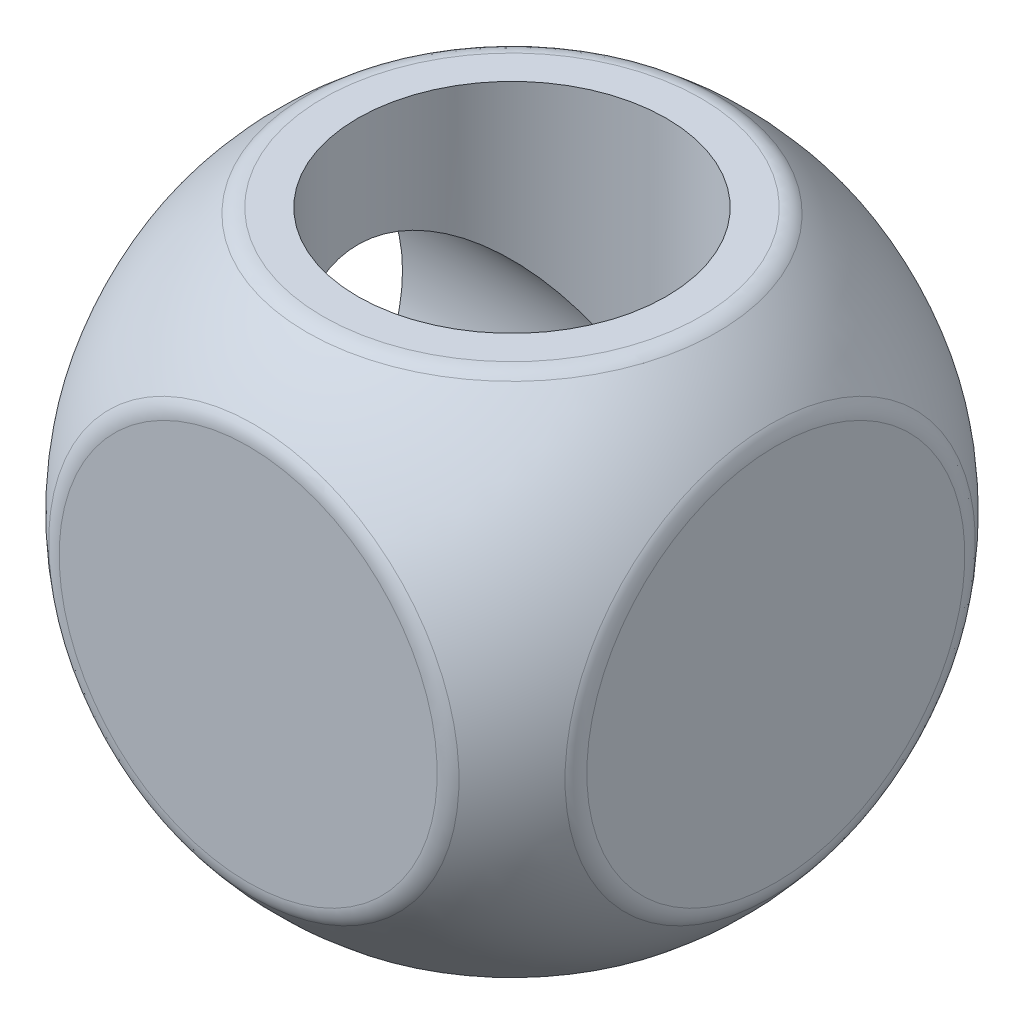
ISO-10303-21;
HEADER;
FILE_DESCRIPTION(('STEP AP214'),'2;1');
FILE_NAME('part.step','',(''),(''),'','','');
FILE_SCHEMA(('AUTOMOTIVE_DESIGN { 1 0 10303 214 1 1 1 1 }'));
ENDSEC;
DATA;
#1=APPLICATION_CONTEXT('core data for automotive mechanical design processes');
#2=APPLICATION_PROTOCOL_DEFINITION('international standard','automotive_design',2000,#1);
#3=PRODUCT_CONTEXT('',#1,'mechanical');
#4=PRODUCT('Part','Part','',(#3));
#5=PRODUCT_RELATED_PRODUCT_CATEGORY('part','',(#4));
#6=PRODUCT_DEFINITION_FORMATION('','',#4);
#7=PRODUCT_DEFINITION_CONTEXT('part definition',#1,'design');
#8=PRODUCT_DEFINITION('design','',#6,#7);
#9=PRODUCT_DEFINITION_SHAPE('','',#8);
#10=(LENGTH_UNIT() NAMED_UNIT(*) SI_UNIT(.MILLI.,.METRE.));
#11=(NAMED_UNIT(*) PLANE_ANGLE_UNIT() SI_UNIT($,.RADIAN.));
#12=(NAMED_UNIT(*) SI_UNIT($,.STERADIAN.) SOLID_ANGLE_UNIT());
#13=UNCERTAINTY_MEASURE_WITH_UNIT(LENGTH_MEASURE(1.E-05),#10,'distance_accuracy_value','');
#14=(GEOMETRIC_REPRESENTATION_CONTEXT(3) GLOBAL_UNCERTAINTY_ASSIGNED_CONTEXT((#13)) GLOBAL_UNIT_ASSIGNED_CONTEXT((#10,
#11,#12)) REPRESENTATION_CONTEXT('',''));
#15=CARTESIAN_POINT('',(0.,0.,0.));
#16=DIRECTION('',(0.,0.,1.));
#17=DIRECTION('',(1.,0.,0.));
#18=AXIS2_PLACEMENT_3D('',#15,#16,#17);
#19=CARTESIAN_POINT('',(0.,0.,0.));
#20=DIRECTION('',(0.,-1.,0.));
#21=DIRECTION('',(-1.,0.,0.));
#22=AXIS2_PLACEMENT_3D('',#19,#20,#21);
#23=SPHERICAL_SURFACE('',#22,12.7);
#24=CARTESIAN_POINT('',(-9.94290598290599,0.,0.));
#25=DIRECTION('',(1.,0.,0.));
#26=DIRECTION('',(0.,1.,0.));
#27=AXIS2_PLACEMENT_3D('',#24,#25,#26);
#28=CIRCLE('',#27,7.90117843205002);
#29=CARTESIAN_POINT('',(-9.94290598290601,7.90117843204998,0.));
#30=VERTEX_POINT('',#29);
#31=EDGE_CURVE('E138',#30,#30,#28,.T.);
#32=ORIENTED_EDGE('',*,*,#31,.T.);
#33=EDGE_LOOP('',(#32));
#34=FACE_BOUND('',#33,.T.);
#35=CARTESIAN_POINT('',(0.,-9.94290598290599,0.));
#36=DIRECTION('',(0.,1.,0.));
#37=DIRECTION('',(0.,0.,1.));
#38=AXIS2_PLACEMENT_3D('',#35,#36,#37);
#39=CIRCLE('',#38,7.90117843205002);
#40=CARTESIAN_POINT('',(0.,-9.94290598290599,7.90117843205002));
#41=VERTEX_POINT('',#40);
#42=EDGE_CURVE('E135',#41,#41,#39,.T.);
#43=ORIENTED_EDGE('',*,*,#42,.T.);
#44=EDGE_LOOP('',(#43));
#45=FACE_BOUND('',#44,.T.);
#46=CARTESIAN_POINT('',(9.94290598290599,1.04146412079564E-13,0.));
#47=DIRECTION('',(-1.,0.,0.));
#48=DIRECTION('',(0.,-1.,0.));
#49=AXIS2_PLACEMENT_3D('',#46,#47,#48);
#50=CIRCLE('',#49,7.90117843205002);
#51=CARTESIAN_POINT('',(9.94290598290607,-7.90117843204991,0.));
#52=VERTEX_POINT('',#51);
#53=EDGE_CURVE('E132',#52,#52,#50,.T.);
#54=ORIENTED_EDGE('',*,*,#53,.T.);
#55=EDGE_LOOP('',(#54));
#56=FACE_BOUND('',#55,.T.);
#57=CARTESIAN_POINT('',(0.,0.,-9.94290598290599));
#58=DIRECTION('',(0.,0.,1.));
#59=DIRECTION('',(0.,-1.,0.));
#60=AXIS2_PLACEMENT_3D('',#57,#58,#59);
#61=CIRCLE('',#60,7.90117843205002);
#62=CARTESIAN_POINT('',(0.,-7.90117843205005,-9.94290598290596));
#63=VERTEX_POINT('',#62);
#64=EDGE_CURVE('E129',#63,#63,#61,.T.);
#65=ORIENTED_EDGE('',*,*,#64,.T.);
#66=EDGE_LOOP('',(#65));
#67=FACE_BOUND('',#66,.T.);
#68=CARTESIAN_POINT('',(0.,1.04146412079564E-13,9.94290598290599));
#69=DIRECTION('',(0.,0.,-1.));
#70=DIRECTION('',(0.,1.,0.));
#71=AXIS2_PLACEMENT_3D('',#68,#69,#70);
#72=CIRCLE('',#71,7.90117843205002);
#73=CARTESIAN_POINT('',(0.,7.90117843205012,9.9429059829059));
#74=VERTEX_POINT('',#73);
#75=EDGE_CURVE('E126',#74,#74,#72,.T.);
#76=ORIENTED_EDGE('',*,*,#75,.T.);
#77=EDGE_LOOP('',(#76));
#78=FACE_BOUND('',#77,.T.);
#79=CARTESIAN_POINT('',(0.,9.94290598290599,0.));
#80=DIRECTION('',(0.,-1.,0.));
#81=DIRECTION('',(0.,0.,-1.));
#82=AXIS2_PLACEMENT_3D('',#79,#80,#81);
#83=CIRCLE('',#82,7.90117843205002);
#84=CARTESIAN_POINT('',(0.,9.94290598290599,-7.90117843205002));
#85=VERTEX_POINT('',#84);
#86=EDGE_CURVE('E123',#85,#85,#83,.T.);
#87=ORIENTED_EDGE('',*,*,#86,.T.);
#88=EDGE_LOOP('',(#87));
#89=FACE_BOUND('',#88,.T.);
#90=ADVANCED_FACE('F53',(#34,#45,#56,#67,#78,#89),#23,.T.);
#91=CARTESIAN_POINT('',(0.,10.16,0.));
#92=DIRECTION('',(0.,1.,0.));
#93=DIRECTION('',(0.,0.,1.));
#94=AXIS2_PLACEMENT_3D('',#91,#92,#93);
#95=PLANE('',#94);
#96=CARTESIAN_POINT('',(0.,10.16,0.));
#97=DIRECTION('',(0.,1.,0.));
#98=DIRECTION('',(0.,0.,1.));
#99=AXIS2_PLACEMENT_3D('',#96,#97,#98);
#100=CIRCLE('',#99,5.94359999999999);
#101=CARTESIAN_POINT('',(0.,10.16,5.94359999999999));
#102=VERTEX_POINT('',#101);
#103=EDGE_CURVE('E120',#102,#102,#100,.T.);
#104=ORIENTED_EDGE('',*,*,#103,.F.);
#105=EDGE_LOOP('',(#104));
#106=FACE_BOUND('',#105,.T.);
#107=CARTESIAN_POINT('',(0.,10.16,0.));
#108=DIRECTION('',(0.,1.,0.));
#109=DIRECTION('',(0.,0.,1.));
#110=AXIS2_PLACEMENT_3D('',#107,#108,#109);
#111=CIRCLE('',#110,7.27903839803033);
#112=CARTESIAN_POINT('',(0.,10.16,7.27903839803033));
#113=VERTEX_POINT('',#112);
#114=EDGE_CURVE('E156',#113,#113,#111,.T.);
#115=ORIENTED_EDGE('',*,*,#114,.T.);
#116=EDGE_LOOP('',(#115));
#117=FACE_BOUND('',#116,.T.);
#118=ADVANCED_FACE('F193',(#106,#117),#95,.T.);
#119=CARTESIAN_POINT('',(-10.16,0.,0.));
#120=DIRECTION('',(-1.,0.,0.));
#121=DIRECTION('',(0.,0.,1.));
#122=AXIS2_PLACEMENT_3D('',#119,#120,#121);
#123=PLANE('',#122);
#124=CARTESIAN_POINT('',(-10.16,0.,0.));
#125=DIRECTION('',(-1.,0.,0.));
#126=DIRECTION('',(0.,0.,1.));
#127=AXIS2_PLACEMENT_3D('',#124,#125,#126);
#128=CIRCLE('',#127,5.94359999999999);
#129=CARTESIAN_POINT('',(-10.16,0.,5.94359999999999));
#130=VERTEX_POINT('',#129);
#131=EDGE_CURVE('E105',#130,#130,#128,.T.);
#132=ORIENTED_EDGE('',*,*,#131,.F.);
#133=EDGE_LOOP('',(#132));
#134=FACE_BOUND('',#133,.T.);
#135=CARTESIAN_POINT('',(-10.16,0.,0.));
#136=DIRECTION('',(-1.,0.,0.));
#137=DIRECTION('',(0.,-1.,0.));
#138=AXIS2_PLACEMENT_3D('',#135,#136,#137);
#139=CIRCLE('',#138,7.27903839803033);
#140=CARTESIAN_POINT('',(-10.16,-7.27903839803037,0.));
#141=VERTEX_POINT('',#140);
#142=EDGE_CURVE('E141',#141,#141,#139,.T.);
#143=ORIENTED_EDGE('',*,*,#142,.T.);
#144=EDGE_LOOP('',(#143));
#145=FACE_BOUND('',#144,.T.);
#146=ADVANCED_FACE('F199',(#134,#145),#123,.T.);
#147=CARTESIAN_POINT('',(0.,-10.16,0.));
#148=DIRECTION('',(0.,-1.,0.));
#149=DIRECTION('',(0.,0.,1.));
#150=AXIS2_PLACEMENT_3D('',#147,#148,#149);
#151=PLANE('',#150);
#152=CARTESIAN_POINT('',(0.,-10.16,0.));
#153=DIRECTION('',(0.,-1.,0.));
#154=DIRECTION('',(0.,0.,-1.));
#155=AXIS2_PLACEMENT_3D('',#152,#153,#154);
#156=CIRCLE('',#155,5.94359999999999);
#157=CARTESIAN_POINT('',(0.,-10.16,-5.94359999999999));
#158=VERTEX_POINT('',#157);
#159=EDGE_CURVE('E257',#158,#158,#156,.T.);
#160=ORIENTED_EDGE('',*,*,#159,.F.);
#161=EDGE_LOOP('',(#160));
#162=FACE_BOUND('',#161,.T.);
#163=CARTESIAN_POINT('',(0.,-10.16,0.));
#164=DIRECTION('',(0.,-1.,0.));
#165=DIRECTION('',(0.,0.,-1.));
#166=AXIS2_PLACEMENT_3D('',#163,#164,#165);
#167=CIRCLE('',#166,7.27903839803033);
#168=CARTESIAN_POINT('',(0.,-10.16,-7.27903839803033));
#169=VERTEX_POINT('',#168);
#170=EDGE_CURVE('E144',#169,#169,#167,.T.);
#171=ORIENTED_EDGE('',*,*,#170,.T.);
#172=EDGE_LOOP('',(#171));
#173=FACE_BOUND('',#172,.T.);
#174=ADVANCED_FACE('F244',(#162,#173),#151,.T.);
#175=CARTESIAN_POINT('',(10.16,1.06420351207939E-13,0.));
#176=DIRECTION('',(1.,0.,0.));
#177=DIRECTION('',(0.,0.,1.));
#178=AXIS2_PLACEMENT_3D('',#175,#176,#177);
#179=PLANE('',#178);
#180=CARTESIAN_POINT('',(10.16,1.06420351207939E-13,0.));
#181=DIRECTION('',(1.,0.,0.));
#182=DIRECTION('',(0.,1.,0.));
#183=AXIS2_PLACEMENT_3D('',#180,#181,#182);
#184=CIRCLE('',#183,7.27903839803033);
#185=CARTESIAN_POINT('',(10.1599999999999,7.27903839803044,0.));
#186=VERTEX_POINT('',#185);
#187=EDGE_CURVE('E147',#186,#186,#184,.T.);
#188=ORIENTED_EDGE('',*,*,#187,.T.);
#189=EDGE_LOOP('',(#188));
#190=FACE_BOUND('',#189,.T.);
#191=ADVANCED_FACE('F238',(#190),#179,.T.);
#192=CARTESIAN_POINT('',(0.,0.,-10.16));
#193=DIRECTION('',(0.,0.,-1.));
#194=DIRECTION('',(0.,1.,0.));
#195=AXIS2_PLACEMENT_3D('',#192,#193,#194);
#196=PLANE('',#195);
#197=CARTESIAN_POINT('',(0.,0.,-10.16));
#198=DIRECTION('',(0.,0.,-1.));
#199=DIRECTION('',(0.,1.,0.));
#200=AXIS2_PLACEMENT_3D('',#197,#198,#199);
#201=CIRCLE('',#200,7.27903839803033);
#202=CARTESIAN_POINT('',(0.,7.27903839803029,-10.16));
#203=VERTEX_POINT('',#202);
#204=EDGE_CURVE('E150',#203,#203,#201,.T.);
#205=ORIENTED_EDGE('',*,*,#204,.T.);
#206=EDGE_LOOP('',(#205));
#207=FACE_BOUND('',#206,.T.);
#208=ADVANCED_FACE('F234',(#207),#196,.T.);
#209=CARTESIAN_POINT('',(0.,1.06420351207939E-13,10.16));
#210=DIRECTION('',(0.,0.,1.));
#211=DIRECTION('',(0.,-1.,0.));
#212=AXIS2_PLACEMENT_3D('',#209,#210,#211);
#213=PLANE('',#212);
#214=CARTESIAN_POINT('',(0.,1.06420351207939E-13,10.16));
#215=DIRECTION('',(0.,0.,1.));
#216=DIRECTION('',(0.,-1.,0.));
#217=AXIS2_PLACEMENT_3D('',#214,#215,#216);
#218=CIRCLE('',#217,7.27903839803033);
#219=CARTESIAN_POINT('',(0.,-7.27903839803022,10.1600000000001));
#220=VERTEX_POINT('',#219);
#221=EDGE_CURVE('E153',#220,#220,#218,.T.);
#222=ORIENTED_EDGE('',*,*,#221,.T.);
#223=EDGE_LOOP('',(#222));
#224=FACE_BOUND('',#223,.T.);
#225=ADVANCED_FACE('F209',(#224),#213,.T.);
#226=CARTESIAN_POINT('',(-9.16,0.,0.));
#227=DIRECTION('',(-1.,0.,0.));
#228=DIRECTION('',(0.,-1.,0.));
#229=AXIS2_PLACEMENT_3D('',#226,#227,#228);
#230=TOROIDAL_SURFACE('',#229,7.27903839803033,1.);
#231=ORIENTED_EDGE('',*,*,#142,.F.);
#232=EDGE_LOOP('',(#231));
#233=FACE_BOUND('',#232,.T.);
#234=ORIENTED_EDGE('',*,*,#31,.F.);
#235=EDGE_LOOP('',(#234));
#236=FACE_BOUND('',#235,.T.);
#237=ADVANCED_FACE('F205',(#233,#236),#230,.T.);
#238=CARTESIAN_POINT('',(0.,-9.16,0.));
#239=DIRECTION('',(0.,-1.,0.));
#240=DIRECTION('',(0.,0.,-1.));
#241=AXIS2_PLACEMENT_3D('',#238,#239,#240);
#242=TOROIDAL_SURFACE('',#241,7.27903839803033,1.);
#243=ORIENTED_EDGE('',*,*,#170,.F.);
#244=EDGE_LOOP('',(#243));
#245=FACE_BOUND('',#244,.T.);
#246=ORIENTED_EDGE('',*,*,#42,.F.);
#247=EDGE_LOOP('',(#246));
#248=FACE_BOUND('',#247,.T.);
#249=ADVANCED_FACE('F208',(#245,#248),#242,.T.);
#250=CARTESIAN_POINT('',(9.16,0.,0.));
#251=DIRECTION('',(1.,0.,0.));
#252=DIRECTION('',(0.,1.,0.));
#253=AXIS2_PLACEMENT_3D('',#250,#251,#252);
#254=TOROIDAL_SURFACE('',#253,7.27903839803033,1.);
#255=ORIENTED_EDGE('',*,*,#187,.F.);
#256=EDGE_LOOP('',(#255));
#257=FACE_BOUND('',#256,.T.);
#258=ORIENTED_EDGE('',*,*,#53,.F.);
#259=EDGE_LOOP('',(#258));
#260=FACE_BOUND('',#259,.T.);
#261=ADVANCED_FACE('F213',(#257,#260),#254,.T.);
#262=CARTESIAN_POINT('',(0.,0.,-9.16));
#263=DIRECTION('',(0.,0.,-1.));
#264=DIRECTION('',(0.,1.,0.));
#265=AXIS2_PLACEMENT_3D('',#262,#263,#264);
#266=TOROIDAL_SURFACE('',#265,7.27903839803033,1.);
#267=ORIENTED_EDGE('',*,*,#204,.F.);
#268=EDGE_LOOP('',(#267));
#269=FACE_BOUND('',#268,.T.);
#270=ORIENTED_EDGE('',*,*,#64,.F.);
#271=EDGE_LOOP('',(#270));
#272=FACE_BOUND('',#271,.T.);
#273=ADVANCED_FACE('F217',(#269,#272),#266,.T.);
#274=CARTESIAN_POINT('',(0.,0.,9.16));
#275=DIRECTION('',(0.,0.,1.));
#276=DIRECTION('',(0.,-1.,0.));
#277=AXIS2_PLACEMENT_3D('',#274,#275,#276);
#278=TOROIDAL_SURFACE('',#277,7.27903839803033,1.);
#279=ORIENTED_EDGE('',*,*,#221,.F.);
#280=EDGE_LOOP('',(#279));
#281=FACE_BOUND('',#280,.T.);
#282=ORIENTED_EDGE('',*,*,#75,.F.);
#283=EDGE_LOOP('',(#282));
#284=FACE_BOUND('',#283,.T.);
#285=ADVANCED_FACE('F185',(#281,#284),#278,.T.);
#286=CARTESIAN_POINT('',(0.,9.16,0.));
#287=DIRECTION('',(0.,1.,0.));
#288=DIRECTION('',(0.,0.,1.));
#289=AXIS2_PLACEMENT_3D('',#286,#287,#288);
#290=TOROIDAL_SURFACE('',#289,7.27903839803033,1.);
#291=ORIENTED_EDGE('',*,*,#114,.F.);
#292=EDGE_LOOP('',(#291));
#293=FACE_BOUND('',#292,.T.);
#294=ORIENTED_EDGE('',*,*,#86,.F.);
#295=EDGE_LOOP('',(#294));
#296=FACE_BOUND('',#295,.T.);
#297=ADVANCED_FACE('F55',(#293,#296),#290,.T.);
#298=CARTESIAN_POINT('',(-10.16,0.,0.));
#299=DIRECTION('',(-1.,0.,0.));
#300=DIRECTION('',(0.,0.,1.));
#301=AXIS2_PLACEMENT_3D('',#298,#299,#300);
#302=CYLINDRICAL_SURFACE('',#301,5.94359999999999);
#303=ORIENTED_EDGE('',*,*,#131,.T.);
#304=EDGE_LOOP('',(#303));
#305=FACE_BOUND('',#304,.T.);
#306=CARTESIAN_POINT('',(0.,0.,0.));
#307=DIRECTION('',(-0.707106781186547,0.707106781186547,0.));
#308=DIRECTION('',(0.707106781186547,0.707106781186547,0.));
#309=AXIS2_PLACEMENT_3D('',#306,#307,#308);
#310=ELLIPSE('',#309,8.40551972932072,5.94359999999999);
#311=CARTESIAN_POINT('',(0.,0.,-5.94359999999999));
#312=VERTEX_POINT('',#311);
#313=CARTESIAN_POINT('',(0.,0.,5.94359999999999));
#314=VERTEX_POINT('',#313);
#315=EDGE_CURVE('E110',#312,#314,#310,.T.);
#316=ORIENTED_EDGE('',*,*,#315,.F.);
#317=CARTESIAN_POINT('',(0.,0.,0.));
#318=DIRECTION('',(0.707106781186547,0.707106781186547,0.));
#319=DIRECTION('',(-0.707106781186547,0.707106781186547,0.));
#320=AXIS2_PLACEMENT_3D('',#317,#318,#319);
#321=ELLIPSE('',#320,8.40551972932072,5.94359999999999);
#322=EDGE_CURVE('E79',#314,#312,#321,.F.);
#323=ORIENTED_EDGE('',*,*,#322,.F.);
#324=EDGE_LOOP('',(#316,#323));
#325=FACE_BOUND('',#324,.T.);
#326=ADVANCED_FACE('F174',(#305,#325),#302,.F.);
#327=CARTESIAN_POINT('',(2.54,0.,0.));
#328=DIRECTION('',(-1.,0.,0.));
#329=DIRECTION('',(0.,0.,1.));
#330=AXIS2_PLACEMENT_3D('',#327,#328,#329);
#331=CONICAL_SURFACE('',#330,5.9436,1.02974425867665);
#332=CARTESIAN_POINT('',(6.11127517525221,0.,0.));
#333=VERTEX_POINT('',#332);
#334=VERTEX_LOOP('',#333);
#335=FACE_BOUND('',#334,.T.);
#336=CARTESIAN_POINT('',(5.93961694446302,0.185163992280996,-0.217558068220168));
#337=CARTESIAN_POINT('',(5.94001982076634,0.197052694965491,-0.206558087179712));
#338=CARTESIAN_POINT('',(5.94042972087786,0.208006664197392,-0.194528299817152));
#339=CARTESIAN_POINT('',(5.94121662234365,0.227760290986906,-0.168795269030674));
#340=CARTESIAN_POINT('',(5.94159357029958,0.236556492100058,-0.155089392687374));
#341=CARTESIAN_POINT('',(5.94227335239499,0.25179396255021,-0.126390275049926));
#342=CARTESIAN_POINT('',(5.94257604238943,0.258230663546639,-0.111394605074271));
#343=CARTESIAN_POINT('',(5.94307397985393,0.268583304015923,-0.0805621316673078));
#344=CARTESIAN_POINT('',(5.94326925355374,0.272499858916901,-0.0647255346165941));
#345=CARTESIAN_POINT('',(5.9435363368348,0.277818881100302,-0.0321091072268573));
#346=CARTESIAN_POINT('',(5.94360396605528,0.279136286163141,-0.0153153261210944));
#347=CARTESIAN_POINT('',(5.94359566900095,0.278973256039045,0.0182608920201604));
#348=CARTESIAN_POINT('',(5.94351971687138,0.277492316953232,0.0350433264680787));
#349=CARTESIAN_POINT('',(5.9432308450632,0.271729708147783,0.0683247360281717));
#350=CARTESIAN_POINT('',(5.94301632204684,0.26741524314921,0.0848180411100224));
#351=CARTESIAN_POINT('',(5.94247317113181,0.256050769279073,0.116833508734265));
#352=CARTESIAN_POINT('',(5.94214454525705,0.249000808928228,0.132355688496276));
#353=CARTESIAN_POINT('',(5.94141565100352,0.232426048939563,0.161788702626177));
#354=CARTESIAN_POINT('',(5.94101622531063,0.222929820755899,0.17571562203392));
#355=CARTESIAN_POINT('',(5.9401905505409,0.201661885703491,0.201709058560483));
#356=CARTESIAN_POINT('',(5.93976430592551,0.189890556634943,0.213775883966801));
#357=CARTESIAN_POINT('',(5.9389508747827,0.164802005511641,0.235278226625749));
#358=CARTESIAN_POINT('',(5.93856287272295,0.151546728384088,0.244785930197398));
#359=CARTESIAN_POINT('',(5.93785800705852,0.123571049682073,0.261327620901443));
#360=CARTESIAN_POINT('',(5.93754112417781,0.108851046669468,0.268362278617546));
#361=CARTESIAN_POINT('',(5.93702928288412,0.0790246834817161,0.279452952907612));
#362=CARTESIAN_POINT('',(5.93682979408326,0.063959982919025,0.283620875238092));
#363=CARTESIAN_POINT('',(5.93655665364665,0.0333357046968885,0.289282348377472));
#364=CARTESIAN_POINT('',(5.93648297532201,0.0177762327096691,0.290776466398817));
#365=CARTESIAN_POINT('',(5.93647053301496,-0.012890646195057,0.291030060320541));
#366=CARTESIAN_POINT('',(5.93652774260504,-0.0279974424514174,0.289871149127713));
#367=CARTESIAN_POINT('',(5.93676217793374,-0.0577987355462884,0.285029106093408));
#368=CARTESIAN_POINT('',(5.93693939842511,-0.072493250381755,0.281346084613696));
#369=CARTESIAN_POINT('',(5.93739331675033,-0.101029977191345,0.271597321498294));
#370=CARTESIAN_POINT('',(5.93766979911105,-0.114873959812096,0.265536738343296));
#371=CARTESIAN_POINT('',(5.93829205513376,-0.141382899073077,0.251235819703023));
#372=CARTESIAN_POINT('',(5.93863783598509,-0.154047733183599,0.242995258029084));
#373=CARTESIAN_POINT('',(5.93937177105762,-0.178202051578166,0.22435007350474));
#374=CARTESIAN_POINT('',(5.9397607969926,-0.189652132181586,0.213894488195512));
#375=CARTESIAN_POINT('',(5.94053218981422,-0.210716870372379,0.191275090703256));
#376=CARTESIAN_POINT('',(5.94091455547042,-0.220331192017401,0.179110966564592));
#377=CARTESIAN_POINT('',(5.94164797073343,-0.237858137142535,0.152900913775669));
#378=CARTESIAN_POINT('',(5.94199716023002,-0.245687482107278,0.138799238994327));
#379=CARTESIAN_POINT('',(5.94260903352824,-0.258962903999543,0.10951398920265));
#380=CARTESIAN_POINT('',(5.94287170127182,-0.264408538582556,0.094330213994596));
#381=CARTESIAN_POINT('',(5.9432906497386,-0.272952177001047,0.0627324800965068));
#382=CARTESIAN_POINT('',(5.94344281204583,-0.275959744200517,0.0462939724001851));
#383=CARTESIAN_POINT('',(5.94360858300715,-0.279231588849202,0.0131448313348029));
#384=CARTESIAN_POINT('',(5.94362217371504,-0.279495510973378,-0.00356583700066791));
#385=CARTESIAN_POINT('',(5.9435082282806,-0.277253016251407,-0.0371126268401775));
#386=CARTESIAN_POINT('',(5.9433780719845,-0.274695166420026,-0.0539453337830179));
#387=CARTESIAN_POINT('',(5.94298701993831,-0.266782882786475,-0.0869402280763325));
#388=CARTESIAN_POINT('',(5.94272612037223,-0.261428367358155,-0.103102395840948));
#389=CARTESIAN_POINT('',(5.94210467398186,-0.248071692178901,-0.134217708040777));
#390=CARTESIAN_POINT('',(5.94174452340252,-0.240080036283156,-0.149175360715256));
#391=CARTESIAN_POINT('',(5.94096623572604,-0.221635241584248,-0.177487852597066));
#392=CARTESIAN_POINT('',(5.94054810513847,-0.211182379015785,-0.190842871423013));
#393=CARTESIAN_POINT('',(5.93971576780874,-0.188391003709184,-0.215179583619157));
#394=CARTESIAN_POINT('',(5.93930174758084,-0.176109380344237,-0.226214503614138));
#395=CARTESIAN_POINT('',(5.93851684036205,-0.149799625604449,-0.24596070970293));
#396=CARTESIAN_POINT('',(5.93814594254117,-0.135771934586961,-0.254672579934093));
#397=CARTESIAN_POINT('',(5.93750719545803,-0.106979857461018,-0.269146524043094));
#398=CARTESIAN_POINT('',(5.93723577074392,-0.0922685824331974,-0.275014093243929));
#399=CARTESIAN_POINT('',(5.936808341297,-0.0620473316089173,-0.284092574746136));
#400=CARTESIAN_POINT('',(5.93665230318696,-0.046537588170546,-0.287304255333369));
#401=CARTESIAN_POINT('',(5.93647808301429,-0.0157654218814558,-0.290881422403996));
#402=CARTESIAN_POINT('',(5.93645509904845,-0.000514481523743693,-0.291346062681055));
#403=CARTESIAN_POINT('',(5.93653677614085,0.0298473011214948,-0.289676976381787));
#404=CARTESIAN_POINT('',(5.93664145644178,0.0449581219430064,-0.287542858097479));
#405=CARTESIAN_POINT('',(5.93696443408802,0.074428878729596,-0.280794191411139));
#406=CARTESIAN_POINT('',(5.93718142347606,0.0887954078917324,-0.276208178048755));
#407=CARTESIAN_POINT('',(5.9377040087587,0.116561742826154,-0.264735269779951));
#408=CARTESIAN_POINT('',(5.93800950552822,0.129962609253842,-0.25785094759007));
#409=CARTESIAN_POINT('',(5.93854057743235,0.15028235158637,-0.245232071735812));
#410=CARTESIAN_POINT('',(5.93874828283765,0.157624989344018,-0.240164467460424));
#411=CARTESIAN_POINT('',(5.93917559813658,0.171794116647103,-0.229354560887092));
#412=CARTESIAN_POINT('',(5.9393952074617,0.178620630804767,-0.223612290795121));
#413=CARTESIAN_POINT('',(5.93961694446302,0.185163992280996,-0.217558068220168));
#414=B_SPLINE_CURVE_WITH_KNOTS('',3,(#336,#337,#338,#339,#340,#341,#342,#343,#344,#345,#346,
#347,#348,#349,#350,#351,#352,#353,#354,#355,#356,#357,#358,#359,#360,#361,#362,#363,#364,#365,
#366,#367,#368,#369,#370,#371,#372,#373,#374,#375,#376,#377,#378,#379,#380,#381,#382,#383,#384,
#385,#386,#387,#388,#389,#390,#391,#392,#393,#394,#395,#396,#397,#398,#399,#400,#401,#402,#403,
#404,#405,#406,#407,#408,#409,#410,#411,#412,#413),.UNSPECIFIED.,.T.,.F.,(4,2,2,2,2,2,2,2,2,2,2,
2,2,2,2,2,2,2,2,2,2,2,2,2,2,2,2,2,2,2,2,2,2,2,2,2,2,2,4),(0.,0.0485727690373229,
0.0972228441310763,0.14596662156417,0.19469849108135,0.245000368080621,0.295311303820916,
0.346215051172635,0.397117895662822,0.447451229476491,0.497776212174578,0.546481556412747,
0.595173683650533,0.641836796071687,0.688490008352818,0.733727422966707,0.778962859789692,
0.824100689499037,0.869243204425418,0.91556638732429,0.961898039219283,1.01007972497065,
1.05827034799822,1.10817584194206,1.15808779898525,1.20892476792284,1.2597632207196,
1.31040157762878,1.36103425382474,1.41033390551557,1.45962114895634,1.50690526630992,
1.55417570069537,1.59972897099843,1.64528910834511,1.69033020625268,1.73532105347572,
1.76205604388345,1.78878975858279),.UNSPECIFIED.);
#415=CARTESIAN_POINT('',(5.93961694446302,0.185163992280996,-0.217558068220168));
#416=VERTEX_POINT('',#415);
#417=EDGE_CURVE('E119',#416,#416,#414,.T.);
#418=ORIENTED_EDGE('',*,*,#417,.F.);
#419=EDGE_LOOP('',(#418));
#420=FACE_BOUND('',#419,.T.);
#421=ADVANCED_FACE('F173',(#335,#420),#331,.F.);
#422=CARTESIAN_POINT('',(2.54,0.,0.));
#423=DIRECTION('',(-1.,0.,0.));
#424=DIRECTION('',(0.,0.,1.));
#425=AXIS2_PLACEMENT_3D('',#422,#423,#424);
#426=CIRCLE('',#425,5.9436);
#427=CARTESIAN_POINT('',(2.54,2.53999999999997,-5.37352593368636));
#428=VERTEX_POINT('',#427);
#429=CARTESIAN_POINT('',(2.54000000000002,-2.54,-5.37352593368636));
#430=VERTEX_POINT('',#429);
#431=EDGE_CURVE('E104',#428,#430,#426,.T.);
#432=ORIENTED_EDGE('',*,*,#431,.T.);
#433=CARTESIAN_POINT('',(2.19944,3.44910053643202,-5.5216704579683));
#434=CARTESIAN_POINT('',(2.24551786978504,3.33368680455851,-5.50332418771256));
#435=CARTESIAN_POINT('',(2.29081311283836,3.21801408419116,-5.48460562234309));
#436=CARTESIAN_POINT('',(2.37943073097658,2.98594871424459,-5.44674133343666));
#437=CARTESIAN_POINT('',(2.42275255982253,2.86955587534231,-5.42759549378946));
#438=CARTESIAN_POINT('',(2.50736231242227,2.63487874752322,-5.38903482089487));
#439=CARTESIAN_POINT('',(2.54862886665554,2.51658683403761,-5.36961910601617));
#440=CARTESIAN_POINT('',(2.62810515200865,2.27893137907036,-5.33117286290329));
#441=CARTESIAN_POINT('',(2.66631509359578,2.15956791200259,-5.31214230821589));
#442=CARTESIAN_POINT('',(2.77379560008829,1.80456499564794,-5.25725493232067));
#443=CARTESIAN_POINT('',(2.83776749437527,1.56704607935615,-5.22273806771006));
#444=CARTESIAN_POINT('',(2.94339306859398,1.08635724601373,-5.16397004591453));
#445=CARTESIAN_POINT('',(2.98513154300119,0.843212543438656,-5.13967996096556));
#446=CARTESIAN_POINT('',(3.02773543003545,0.44609550913111,-5.11464087484209));
#447=CARTESIAN_POINT('',(3.03812133668576,0.293514544397181,-5.10844500086465));
#448=CARTESIAN_POINT('',(3.04598885198586,-0.0121539238332666,-5.10375980790303));
#449=CARTESIAN_POINT('',(3.04346789108491,-0.165241522129536,-5.10527202347585));
#450=CARTESIAN_POINT('',(3.02579038095276,-0.470612988472281,-5.11576646932476));
#451=CARTESIAN_POINT('',(3.01061522659536,-0.622895340627013,-5.12475969869039));
#452=CARTESIAN_POINT('',(2.96921168705156,-0.925443556024016,-5.14885670035971));
#453=CARTESIAN_POINT('',(2.94297943668176,-1.07570869514597,-5.1639626093737));
#454=CARTESIAN_POINT('',(2.87390332536196,-1.41123946632358,-5.2027855772804));
#455=CARTESIAN_POINT('',(2.82854340600261,-1.59583271287637,-5.22771210881816));
#456=CARTESIAN_POINT('',(2.72770026290748,-1.96175243944838,-5.28103092416859));
#457=CARTESIAN_POINT('',(2.67221045764492,-2.14307671091984,-5.30942545719693));
#458=CARTESIAN_POINT('',(2.55404939603869,-2.50299091933303,-5.36726559504254));
#459=CARTESIAN_POINT('',(2.4913843850866,-2.6815830831141,-5.39671027065908));
#460=CARTESIAN_POINT('',(2.393526563335,-2.94788031566106,-5.44046812021877));
#461=CARTESIAN_POINT('',(2.36030123016137,-3.03628784718937,-5.45497069132237));
#462=CARTESIAN_POINT('',(2.29272192141025,-3.21270306132343,-5.48371750259358));
#463=CARTESIAN_POINT('',(2.25836805469867,-3.30071078157076,-5.49796176747458));
#464=CARTESIAN_POINT('',(2.2235345117003,-3.38856000000009,-5.51201190449353));
#465=B_SPLINE_CURVE_WITH_KNOTS('',3,(#433,#434,#435,#436,#437,#438,#439,#440,#441,#442,#443,
#444,#445,#446,#447,#448,#449,#450,#451,#452,#453,#454,#455,#456,#457,#458,#459,#460,#461,#462,
#463,#464),.UNSPECIFIED.,.F.,.F.,(4,2,2,2,2,2,2,2,2,2,2,2,2,2,2,4),(0.,0.376860605098273,
0.753824898699011,1.13412214759404,1.51439318801603,2.25884691862661,3.00044072463086,
3.45894110891806,3.91753277684199,4.37679989125869,4.83622768310228,5.41086557619759,
5.98587815689517,6.56039399033512,6.84704373060976,7.13366589946706),.UNSPECIFIED.);
#466=EDGE_CURVE('E67',#428,#430,#465,.T.);
#467=ORIENTED_EDGE('',*,*,#466,.F.);
#468=EDGE_LOOP('',(#432,#467));
#469=FACE_BOUND('',#468,.T.);
#470=ADVANCED_FACE('F172',(#469),#331,.F.);
#471=CARTESIAN_POINT('',(0.,0.,0.));
#472=DIRECTION('',(0.707106781186547,0.707106781186547,0.));
#473=DIRECTION('',(-0.707106781186547,0.707106781186547,0.));
#474=AXIS2_PLACEMENT_3D('',#471,#472,#473);
#475=ELLIPSE('',#474,8.40551972932072,5.94359999999999);
#476=EDGE_CURVE('E112',#430,#312,#475,.T.);
#477=ORIENTED_EDGE('',*,*,#476,.F.);
#478=ORIENTED_EDGE('',*,*,#431,.F.);
#479=CARTESIAN_POINT('',(0.,0.,0.));
#480=DIRECTION('',(-0.707106781186547,0.707106781186547,0.));
#481=DIRECTION('',(0.707106781186547,0.707106781186547,0.));
#482=AXIS2_PLACEMENT_3D('',#479,#480,#481);
#483=ELLIPSE('',#482,8.40551972932072,5.94359999999999);
#484=EDGE_CURVE('E115',#312,#428,#483,.F.);
#485=ORIENTED_EDGE('',*,*,#484,.F.);
#486=EDGE_LOOP('',(#477,#478,#485));
#487=FACE_BOUND('',#486,.T.);
#488=ADVANCED_FACE('F179',(#487),#302,.F.);
#489=CARTESIAN_POINT('',(0.,10.16,0.));
#490=DIRECTION('',(0.,1.,0.));
#491=DIRECTION('',(0.,0.,1.));
#492=AXIS2_PLACEMENT_3D('',#489,#490,#491);
#493=CYLINDRICAL_SURFACE('',#492,5.94359999999999);
#494=ORIENTED_EDGE('',*,*,#476,.T.);
#495=ORIENTED_EDGE('',*,*,#315,.T.);
#496=CARTESIAN_POINT('',(2.54000000000001,-2.54,5.37352593368636));
#497=VERTEX_POINT('',#496);
#498=EDGE_CURVE('E100',#314,#497,#475,.T.);
#499=ORIENTED_EDGE('',*,*,#498,.T.);
#500=CARTESIAN_POINT('',(2.22353451170027,-3.38855999999999,5.51201190449347));
#501=CARTESIAN_POINT('',(2.26831539857609,-3.27559266168567,5.49395486177722));
#502=CARTESIAN_POINT('',(2.31232142980613,-3.16236629555875,5.47556092197878));
#503=CARTESIAN_POINT('',(2.39838809254666,-2.93520107015031,5.43840900765837));
#504=CARTESIAN_POINT('',(2.44044819183968,-2.82126202550938,5.41965093551342));
#505=CARTESIAN_POINT('',(2.5225472165481,-2.59157386668371,5.38193230845324));
#506=CARTESIAN_POINT('',(2.5625661067594,-2.47581759099376,5.36297137997027));
#507=CARTESIAN_POINT('',(2.6396144407801,-2.24325889152898,5.32547291334427));
#508=CARTESIAN_POINT('',(2.67664407926528,-2.1264565364316,5.30693534768611));
#509=CARTESIAN_POINT('',(2.78049409475394,-1.78000918879692,5.25367558153821));
#510=CARTESIAN_POINT('',(2.84220408325989,-1.54855722250027,5.22030453693441));
#511=CARTESIAN_POINT('',(2.9443382754113,-1.08029122627425,5.16340629578163));
#512=CARTESIAN_POINT('',(2.98483713627514,-0.843499104998861,5.13984463386067));
#513=CARTESIAN_POINT('',(3.02993413505616,-0.427364887302366,5.11335469727089));
#514=CARTESIAN_POINT('',(3.0411105771818,-0.249013178164326,5.10666476720187));
#515=CARTESIAN_POINT('',(3.04571624658967,0.108053820752507,5.10392106616146));
#516=CARTESIAN_POINT('',(3.03914262878248,0.286769164229018,5.10786900029255));
#517=CARTESIAN_POINT('',(3.00925141314498,0.642689315156428,5.12552990634235));
#518=CARTESIAN_POINT('',(2.9858886905284,0.819888746663931,5.13926919406664));
#519=CARTESIAN_POINT('',(2.92544606901275,1.1712232609239,5.17390903612071));
#520=CARTESIAN_POINT('',(2.88835645234208,1.345356081,5.1948146629893));
#521=CARTESIAN_POINT('',(2.80546093250048,1.68385443610846,5.24002942646863));
#522=CARTESIAN_POINT('',(2.76004122092864,1.8483392523664,5.26417842937318));
#523=CARTESIAN_POINT('',(2.66211572729943,2.17482432393057,5.31437241025841));
#524=CARTESIAN_POINT('',(2.60961112582849,2.33682498818405,5.34041707202476));
#525=CARTESIAN_POINT('',(2.49967141030968,2.65802370730726,5.392744443956));
#526=CARTESIAN_POINT('',(2.44226618613064,2.81723248745506,5.41902494330222));
#527=CARTESIAN_POINT('',(2.32351447684863,3.13414844930578,5.47100987730373));
#528=CARTESIAN_POINT('',(2.26217066785192,3.29185656871719,5.49671468742941));
#529=CARTESIAN_POINT('',(2.19944,3.44910053643202,5.52167045796831));
#530=B_SPLINE_CURVE_WITH_KNOTS('',3,(#500,#501,#502,#503,#504,#505,#506,#507,#508,#509,#510,
#511,#512,#513,#514,#515,#516,#517,#518,#519,#520,#521,#522,#523,#524,#525,#526,#527,#528,#529),
.UNSPECIFIED.,.F.,.F.,(4,2,2,2,2,2,2,2,2,2,2,2,2,2,4),(0.,0.368565022758872,0.737230260207839,
1.10900438683177,1.48075428200378,2.2055963803693,2.92786979582188,3.46323301062892,
3.99868204185762,4.53557563057404,5.07285003526086,5.58964211735515,6.10634819020684,
6.62010155646897,7.13350946879641),.UNSPECIFIED.);
#531=CARTESIAN_POINT('',(2.54,2.53999999999997,5.37352593368636));
#532=VERTEX_POINT('',#531);
#533=EDGE_CURVE('E14',#497,#532,#530,.T.);
#534=ORIENTED_EDGE('',*,*,#533,.T.);
#535=EDGE_CURVE('E102',#532,#314,#483,.F.);
#536=ORIENTED_EDGE('',*,*,#535,.T.);
#537=ORIENTED_EDGE('',*,*,#322,.T.);
#538=ORIENTED_EDGE('',*,*,#484,.T.);
#539=ORIENTED_EDGE('',*,*,#466,.T.);
#540=EDGE_LOOP('',(#494,#495,#499,#534,#536,#537,#538,#539));
#541=FACE_BOUND('',#540,.T.);
#542=ORIENTED_EDGE('',*,*,#159,.T.);
#543=EDGE_LOOP('',(#542));
#544=FACE_BOUND('',#543,.T.);
#545=ORIENTED_EDGE('',*,*,#103,.T.);
#546=EDGE_LOOP('',(#545));
#547=FACE_BOUND('',#546,.T.);
#548=ORIENTED_EDGE('',*,*,#417,.T.);
#549=EDGE_LOOP('',(#548));
#550=FACE_BOUND('',#549,.T.);
#551=ADVANCED_FACE('F108',(#541,#544,#547,#550),#493,.F.);
#552=EDGE_CURVE('E96',#497,#532,#426,.T.);
#553=ORIENTED_EDGE('',*,*,#552,.T.);
#554=ORIENTED_EDGE('',*,*,#533,.F.);
#555=EDGE_LOOP('',(#553,#554));
#556=FACE_BOUND('',#555,.T.);
#557=ADVANCED_FACE('F107',(#556),#331,.F.);
#558=ORIENTED_EDGE('',*,*,#552,.F.);
#559=ORIENTED_EDGE('',*,*,#498,.F.);
#560=ORIENTED_EDGE('',*,*,#535,.F.);
#561=EDGE_LOOP('',(#558,#559,#560));
#562=FACE_BOUND('',#561,.T.);
#563=ADVANCED_FACE('F98',(#562),#302,.F.);
#564=CLOSED_SHELL('',(#90,#118,#146,#174,#191,#208,#225,#237,#249,#261,#273,#285,#297,#326,#421,
#470,#488,#551,#557,#563));
#565=MANIFOLD_SOLID_BREP('B2',#564);
#566=ADVANCED_BREP_SHAPE_REPRESENTATION('',(#18,#565),#14);
#567=SHAPE_DEFINITION_REPRESENTATION(#9,#566);
ENDSEC;
END-ISO-10303-21;
